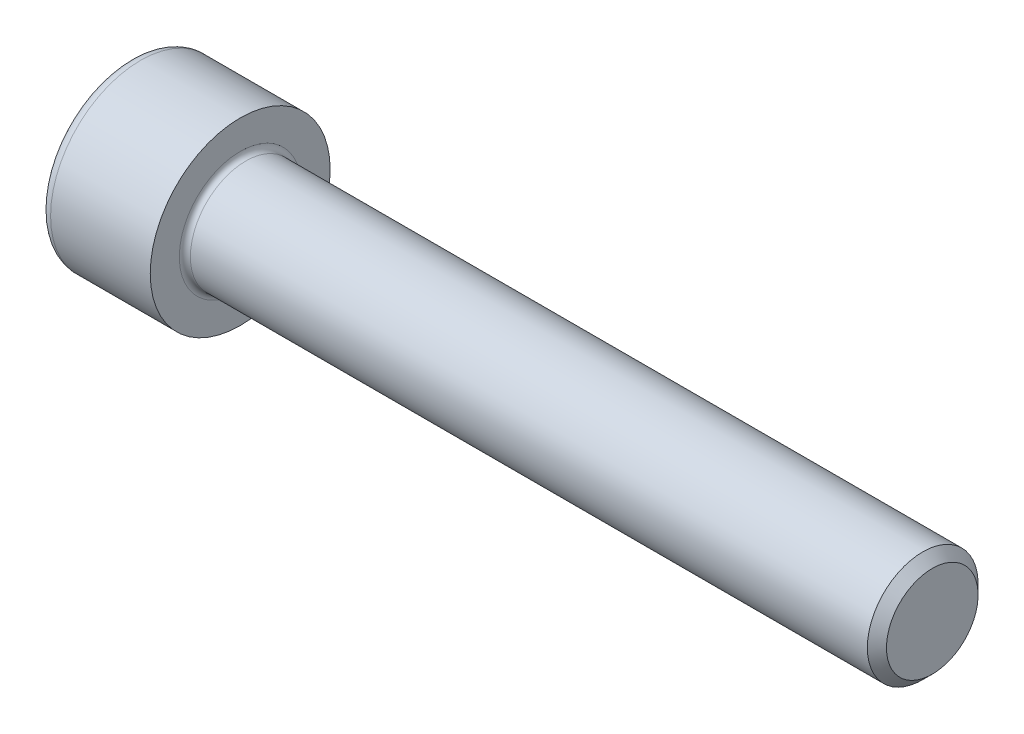
ISO-10303-21;
HEADER;
FILE_DESCRIPTION(('STEP AP214'),'2;1');
FILE_NAME('part.step','',(''),(''),'','','');
FILE_SCHEMA(('AUTOMOTIVE_DESIGN { 1 0 10303 214 1 1 1 1 }'));
ENDSEC;
DATA;
#1=APPLICATION_CONTEXT('core data for automotive mechanical design processes');
#2=APPLICATION_PROTOCOL_DEFINITION('international standard','automotive_design',2000,#1);
#3=PRODUCT_CONTEXT('',#1,'mechanical');
#4=PRODUCT('Part','Part','',(#3));
#5=PRODUCT_RELATED_PRODUCT_CATEGORY('part','',(#4));
#6=PRODUCT_DEFINITION_FORMATION('','',#4);
#7=PRODUCT_DEFINITION_CONTEXT('part definition',#1,'design');
#8=PRODUCT_DEFINITION('design','',#6,#7);
#9=PRODUCT_DEFINITION_SHAPE('','',#8);
#10=(LENGTH_UNIT() NAMED_UNIT(*) SI_UNIT(.MILLI.,.METRE.));
#11=(NAMED_UNIT(*) PLANE_ANGLE_UNIT() SI_UNIT($,.RADIAN.));
#12=(NAMED_UNIT(*) SI_UNIT($,.STERADIAN.) SOLID_ANGLE_UNIT());
#13=UNCERTAINTY_MEASURE_WITH_UNIT(LENGTH_MEASURE(1.E-05),#10,'distance_accuracy_value','');
#14=(GEOMETRIC_REPRESENTATION_CONTEXT(3) GLOBAL_UNCERTAINTY_ASSIGNED_CONTEXT((#13)) GLOBAL_UNIT_ASSIGNED_CONTEXT((#10,
#11,#12)) REPRESENTATION_CONTEXT('',''));
#15=CARTESIAN_POINT('',(0.,0.,0.));
#16=DIRECTION('',(0.,0.,1.));
#17=DIRECTION('',(1.,0.,0.));
#18=AXIS2_PLACEMENT_3D('',#15,#16,#17);
#19=CARTESIAN_POINT('',(0.,0.,0.));
#20=DIRECTION('',(-1.,0.,0.));
#21=DIRECTION('',(0.,0.,1.));
#22=AXIS2_PLACEMENT_3D('',#19,#20,#21);
#23=PLANE('',#22);
#24=DIRECTION('',(0.,-0.499999999999999,0.866025403784439));
#25=VECTOR('',#24,1.);
#26=CARTESIAN_POINT('',(0.,3.47564862052154,0.));
#27=LINE('',#26,#25);
#28=CARTESIAN_POINT('',(0.,3.47564862052154,0.));
#29=VERTEX_POINT('',#28);
#30=CARTESIAN_POINT('',(0.,1.73782431026077,3.00999999999999));
#31=VERTEX_POINT('',#30);
#32=EDGE_CURVE('E260',#29,#31,#27,.T.);
#33=ORIENTED_EDGE('',*,*,#32,.T.);
#34=DIRECTION('',(0.,1.,0.));
#35=VECTOR('',#34,1.);
#36=CARTESIAN_POINT('',(0.,-1.73782431026077,3.01));
#37=LINE('',#36,#35);
#38=CARTESIAN_POINT('',(0.,-1.73782431026077,3.01));
#39=VERTEX_POINT('',#38);
#40=EDGE_CURVE('E132',#39,#31,#37,.T.);
#41=ORIENTED_EDGE('',*,*,#40,.F.);
#42=DIRECTION('',(0.,-0.500000000000001,-0.866025403784438));
#43=VECTOR('',#42,1.);
#44=CARTESIAN_POINT('',(0.,-1.73782431026077,3.01));
#45=LINE('',#44,#43);
#46=CARTESIAN_POINT('',(0.,-3.47564862052155,0.));
#47=VERTEX_POINT('',#46);
#48=EDGE_CURVE('E263',#39,#47,#45,.T.);
#49=ORIENTED_EDGE('',*,*,#48,.T.);
#50=DIRECTION('',(0.,0.499999999999999,-0.866025403784439));
#51=VECTOR('',#50,1.);
#52=CARTESIAN_POINT('',(0.,-3.47564862052155,0.));
#53=LINE('',#52,#51);
#54=CARTESIAN_POINT('',(0.,-1.73782431026078,-3.01));
#55=VERTEX_POINT('',#54);
#56=EDGE_CURVE('E266',#47,#55,#53,.T.);
#57=ORIENTED_EDGE('',*,*,#56,.T.);
#58=DIRECTION('',(0.,-1.,0.));
#59=VECTOR('',#58,1.);
#60=CARTESIAN_POINT('',(0.,1.73782431026076,-3.01));
#61=LINE('',#60,#59);
#62=CARTESIAN_POINT('',(0.,1.73782431026076,-3.01));
#63=VERTEX_POINT('',#62);
#64=EDGE_CURVE('E269',#63,#55,#61,.T.);
#65=ORIENTED_EDGE('',*,*,#64,.F.);
#66=DIRECTION('',(0.,-0.500000000000001,-0.866025403784438));
#67=VECTOR('',#66,1.);
#68=CARTESIAN_POINT('',(0.,3.47564862052154,0.));
#69=LINE('',#68,#67);
#70=EDGE_CURVE('E127',#29,#63,#69,.T.);
#71=ORIENTED_EDGE('',*,*,#70,.F.);
#72=EDGE_LOOP('',(#33,#41,#49,#57,#65,#71));
#73=FACE_BOUND('',#72,.T.);
#74=CARTESIAN_POINT('',(0.,0.,0.));
#75=DIRECTION('',(-1.,0.,0.));
#76=DIRECTION('',(0.,0.,1.));
#77=AXIS2_PLACEMENT_3D('',#74,#75,#76);
#78=CIRCLE('',#77,5.7);
#79=CARTESIAN_POINT('',(0.,0.,5.7));
#80=VERTEX_POINT('',#79);
#81=EDGE_CURVE('E44',#80,#80,#78,.T.);
#82=ORIENTED_EDGE('',*,*,#81,.T.);
#83=EDGE_LOOP('',(#82));
#84=FACE_BOUND('',#83,.T.);
#85=ADVANCED_FACE('F36',(#73,#84),#23,.T.);
#86=CARTESIAN_POINT('',(-31.75,0.,0.));
#87=DIRECTION('',(-1.,0.,0.));
#88=DIRECTION('',(0.,0.,1.));
#89=AXIS2_PLACEMENT_3D('',#86,#87,#88);
#90=CYLINDRICAL_SURFACE('',#89,6.5);
#91=CARTESIAN_POINT('',(0.800000000000002,0.,0.));
#92=DIRECTION('',(-1.,0.,0.));
#93=DIRECTION('',(0.,0.,1.));
#94=AXIS2_PLACEMENT_3D('',#91,#92,#93);
#95=CIRCLE('',#94,6.5);
#96=CARTESIAN_POINT('',(0.800000000000002,0.,6.5));
#97=VERTEX_POINT('',#96);
#98=EDGE_CURVE('E11',#97,#97,#95,.F.);
#99=ORIENTED_EDGE('',*,*,#98,.T.);
#100=EDGE_LOOP('',(#99));
#101=FACE_BOUND('',#100,.T.);
#102=CARTESIAN_POINT('',(8.,0.,0.));
#103=DIRECTION('',(-1.,0.,0.));
#104=DIRECTION('',(0.,0.,1.));
#105=AXIS2_PLACEMENT_3D('',#102,#103,#104);
#106=CIRCLE('',#105,6.5);
#107=CARTESIAN_POINT('',(8.,0.,6.5));
#108=VERTEX_POINT('',#107);
#109=EDGE_CURVE('E150',#108,#108,#106,.T.);
#110=ORIENTED_EDGE('',*,*,#109,.T.);
#111=EDGE_LOOP('',(#110));
#112=FACE_BOUND('',#111,.T.);
#113=ADVANCED_FACE('F174',(#101,#112),#90,.T.);
#114=CARTESIAN_POINT('',(8.,6.5,0.));
#115=DIRECTION('',(1.,0.,0.));
#116=DIRECTION('',(0.,0.,-1.));
#117=AXIS2_PLACEMENT_3D('',#114,#115,#116);
#118=PLANE('',#117);
#119=CARTESIAN_POINT('',(8.,0.,0.));
#120=DIRECTION('',(1.,0.,0.));
#121=DIRECTION('',(0.,0.,-1.));
#122=AXIS2_PLACEMENT_3D('',#119,#120,#121);
#123=CIRCLE('',#122,4.39999999999985);
#124=CARTESIAN_POINT('',(8.,0.,-4.39999999999985));
#125=VERTEX_POINT('',#124);
#126=EDGE_CURVE('E153',#125,#125,#123,.F.);
#127=ORIENTED_EDGE('',*,*,#126,.T.);
#128=EDGE_LOOP('',(#127));
#129=FACE_BOUND('',#128,.T.);
#130=ORIENTED_EDGE('',*,*,#109,.F.);
#131=EDGE_LOOP('',(#130));
#132=FACE_BOUND('',#131,.T.);
#133=ADVANCED_FACE('F180',(#129,#132),#118,.T.);
#134=CARTESIAN_POINT('',(-31.75,0.,0.));
#135=DIRECTION('',(-1.,0.,0.));
#136=DIRECTION('',(0.,0.,1.));
#137=AXIS2_PLACEMENT_3D('',#134,#135,#136);
#138=CYLINDRICAL_SURFACE('',#137,3.99999999999985);
#139=CARTESIAN_POINT('',(8.4,0.,0.));
#140=DIRECTION('',(1.,0.,0.));
#141=DIRECTION('',(0.,0.,-1.));
#142=AXIS2_PLACEMENT_3D('',#139,#140,#141);
#143=CIRCLE('',#142,3.99999999999985);
#144=CARTESIAN_POINT('',(8.4,0.,-3.99999999999985));
#145=VERTEX_POINT('',#144);
#146=EDGE_CURVE('E156',#145,#145,#143,.T.);
#147=ORIENTED_EDGE('',*,*,#146,.T.);
#148=EDGE_LOOP('',(#147));
#149=FACE_BOUND('',#148,.T.);
#150=CARTESIAN_POINT('',(57.3094999999997,0.,0.));
#151=DIRECTION('',(-1.,0.,0.));
#152=DIRECTION('',(0.,0.,1.));
#153=AXIS2_PLACEMENT_3D('',#150,#151,#152);
#154=CIRCLE('',#153,3.99999999999971);
#155=CARTESIAN_POINT('',(57.3094999999997,0.,3.99999999999971));
#156=VERTEX_POINT('',#155);
#157=EDGE_CURVE('E147',#156,#156,#154,.T.);
#158=ORIENTED_EDGE('',*,*,#157,.T.);
#159=EDGE_LOOP('',(#158));
#160=FACE_BOUND('',#159,.T.);
#161=ADVANCED_FACE('F186',(#149,#160),#138,.T.);
#162=CARTESIAN_POINT('',(58.,0.,0.));
#163=DIRECTION('',(-1.,0.,0.));
#164=DIRECTION('',(0.,0.,1.));
#165=AXIS2_PLACEMENT_3D('',#162,#163,#164);
#166=CONICAL_SURFACE('',#165,3.3095,0.78539816339702);
#167=ORIENTED_EDGE('',*,*,#157,.F.);
#168=EDGE_LOOP('',(#167));
#169=FACE_BOUND('',#168,.T.);
#170=CARTESIAN_POINT('',(58.,0.,0.));
#171=DIRECTION('',(-1.,0.,0.));
#172=DIRECTION('',(0.,0.,1.));
#173=AXIS2_PLACEMENT_3D('',#170,#171,#172);
#174=CIRCLE('',#173,3.3095);
#175=CARTESIAN_POINT('',(58.,0.,3.3095));
#176=VERTEX_POINT('',#175);
#177=EDGE_CURVE('E143',#176,#176,#174,.T.);
#178=ORIENTED_EDGE('',*,*,#177,.T.);
#179=EDGE_LOOP('',(#178));
#180=FACE_BOUND('',#179,.T.);
#181=ADVANCED_FACE('F190',(#169,#180),#166,.T.);
#182=CARTESIAN_POINT('',(58.,3.3095,0.));
#183=DIRECTION('',(1.,0.,0.));
#184=DIRECTION('',(0.,0.,-1.));
#185=AXIS2_PLACEMENT_3D('',#182,#183,#184);
#186=PLANE('',#185);
#187=ORIENTED_EDGE('',*,*,#177,.F.);
#188=EDGE_LOOP('',(#187));
#189=FACE_BOUND('',#188,.T.);
#190=ADVANCED_FACE('F170',(#189),#186,.T.);
#191=CARTESIAN_POINT('',(8.4,0.,0.));
#192=DIRECTION('',(1.,0.,0.));
#193=DIRECTION('',(0.,0.,-1.));
#194=AXIS2_PLACEMENT_3D('',#191,#192,#193);
#195=TOROIDAL_SURFACE('',#194,4.39999999999985,0.4);
#196=ORIENTED_EDGE('',*,*,#146,.F.);
#197=EDGE_LOOP('',(#196));
#198=FACE_BOUND('',#197,.T.);
#199=ORIENTED_EDGE('',*,*,#126,.F.);
#200=EDGE_LOOP('',(#199));
#201=FACE_BOUND('',#200,.T.);
#202=ADVANCED_FACE('F163',(#198,#201),#195,.F.);
#203=CARTESIAN_POINT('',(0.800000000000002,0.,0.));
#204=DIRECTION('',(-1.,0.,0.));
#205=DIRECTION('',(0.,0.,1.));
#206=AXIS2_PLACEMENT_3D('',#203,#204,#205);
#207=TOROIDAL_SURFACE('',#206,5.7,0.8);
#208=ORIENTED_EDGE('',*,*,#98,.F.);
#209=EDGE_LOOP('',(#208));
#210=FACE_BOUND('',#209,.T.);
#211=ORIENTED_EDGE('',*,*,#81,.F.);
#212=EDGE_LOOP('',(#211));
#213=FACE_BOUND('',#212,.T.);
#214=ADVANCED_FACE('F38',(#210,#213),#207,.T.);
#215=CARTESIAN_POINT('',(4.,3.47564862052154,0.));
#216=DIRECTION('',(0.,-0.866025403784439,-0.499999999999999));
#217=DIRECTION('',(0.,0.499999999999999,-0.866025403784439));
#218=AXIS2_PLACEMENT_3D('',#215,#216,#217);
#219=PLANE('',#218);
#220=ORIENTED_EDGE('',*,*,#32,.F.);
#221=DIRECTION('',(-1.,0.,0.));
#222=VECTOR('',#221,1.);
#223=CARTESIAN_POINT('',(4.,3.47564862052154,0.));
#224=LINE('',#223,#222);
#225=CARTESIAN_POINT('',(4.,3.47564862052154,0.));
#226=VERTEX_POINT('',#225);
#227=EDGE_CURVE('E250',#226,#29,#224,.T.);
#228=ORIENTED_EDGE('',*,*,#227,.F.);
#229=DIRECTION('',(0.,-0.499999999999999,0.866025403784439));
#230=VECTOR('',#229,1.);
#231=CARTESIAN_POINT('',(4.,3.47564862052154,0.));
#232=LINE('',#231,#230);
#233=CARTESIAN_POINT('',(4.,2.60673646539116,1.50499999999999));
#234=VERTEX_POINT('',#233);
#235=EDGE_CURVE('E119',#226,#234,#232,.T.);
#236=ORIENTED_EDGE('',*,*,#235,.T.);
#237=CARTESIAN_POINT('',(4.,1.73782431026077,3.00999999999999));
#238=VERTEX_POINT('',#237);
#239=EDGE_CURVE('E110',#234,#238,#232,.T.);
#240=ORIENTED_EDGE('',*,*,#239,.T.);
#241=DIRECTION('',(-1.,0.,0.));
#242=VECTOR('',#241,1.);
#243=CARTESIAN_POINT('',(4.,1.73782431026077,3.00999999999999));
#244=LINE('',#243,#242);
#245=EDGE_CURVE('E124',#238,#31,#244,.T.);
#246=ORIENTED_EDGE('',*,*,#245,.T.);
#247=EDGE_LOOP('',(#220,#228,#236,#240,#246));
#248=FACE_BOUND('',#247,.T.);
#249=ADVANCED_FACE('F123',(#248),#219,.T.);
#250=CARTESIAN_POINT('',(4.,-1.73782431026077,3.01));
#251=DIRECTION('',(0.,0.,1.));
#252=DIRECTION('',(0.,-1.,0.));
#253=AXIS2_PLACEMENT_3D('',#250,#251,#252);
#254=PLANE('',#253);
#255=ORIENTED_EDGE('',*,*,#40,.T.);
#256=ORIENTED_EDGE('',*,*,#245,.F.);
#257=DIRECTION('',(0.,1.,0.));
#258=VECTOR('',#257,1.);
#259=CARTESIAN_POINT('',(4.,-1.73782431026077,3.01));
#260=LINE('',#259,#258);
#261=CARTESIAN_POINT('',(4.,0.,3.00999999999999));
#262=VERTEX_POINT('',#261);
#263=EDGE_CURVE('E107',#262,#238,#260,.T.);
#264=ORIENTED_EDGE('',*,*,#263,.F.);
#265=CARTESIAN_POINT('',(4.,-1.73782431026077,3.01));
#266=VERTEX_POINT('',#265);
#267=EDGE_CURVE('E118',#266,#262,#260,.T.);
#268=ORIENTED_EDGE('',*,*,#267,.F.);
#269=DIRECTION('',(-1.,0.,0.));
#270=VECTOR('',#269,1.);
#271=CARTESIAN_POINT('',(4.,-1.73782431026077,3.01));
#272=LINE('',#271,#270);
#273=EDGE_CURVE('E134',#266,#39,#272,.T.);
#274=ORIENTED_EDGE('',*,*,#273,.T.);
#275=EDGE_LOOP('',(#255,#256,#264,#268,#274));
#276=FACE_BOUND('',#275,.T.);
#277=ADVANCED_FACE('F129',(#276),#254,.F.);
#278=CARTESIAN_POINT('',(4.,-1.73782431026077,3.01));
#279=DIRECTION('',(0.,0.866025403784438,-0.500000000000001));
#280=DIRECTION('',(0.,0.500000000000001,0.866025403784438));
#281=AXIS2_PLACEMENT_3D('',#278,#279,#280);
#282=PLANE('',#281);
#283=ORIENTED_EDGE('',*,*,#48,.F.);
#284=ORIENTED_EDGE('',*,*,#273,.F.);
#285=DIRECTION('',(0.,-0.500000000000001,-0.866025403784438));
#286=VECTOR('',#285,1.);
#287=CARTESIAN_POINT('',(4.,-1.73782431026077,3.01));
#288=LINE('',#287,#286);
#289=CARTESIAN_POINT('',(4.,-2.60673646539116,1.505));
#290=VERTEX_POINT('',#289);
#291=EDGE_CURVE('E289',#266,#290,#288,.T.);
#292=ORIENTED_EDGE('',*,*,#291,.T.);
#293=CARTESIAN_POINT('',(4.,-3.47564862052155,0.));
#294=VERTEX_POINT('',#293);
#295=EDGE_CURVE('E278',#290,#294,#288,.T.);
#296=ORIENTED_EDGE('',*,*,#295,.T.);
#297=DIRECTION('',(-1.,0.,0.));
#298=VECTOR('',#297,1.);
#299=CARTESIAN_POINT('',(4.,-3.47564862052155,0.));
#300=LINE('',#299,#298);
#301=EDGE_CURVE('E139',#294,#47,#300,.T.);
#302=ORIENTED_EDGE('',*,*,#301,.T.);
#303=EDGE_LOOP('',(#283,#284,#292,#296,#302));
#304=FACE_BOUND('',#303,.T.);
#305=ADVANCED_FACE('F204',(#304),#282,.T.);
#306=CARTESIAN_POINT('',(4.,-3.47564862052155,0.));
#307=DIRECTION('',(0.,0.866025403784439,0.499999999999999));
#308=DIRECTION('',(0.,-0.499999999999999,0.866025403784439));
#309=AXIS2_PLACEMENT_3D('',#306,#307,#308);
#310=PLANE('',#309);
#311=ORIENTED_EDGE('',*,*,#56,.F.);
#312=ORIENTED_EDGE('',*,*,#301,.F.);
#313=DIRECTION('',(0.,0.499999999999999,-0.866025403784439));
#314=VECTOR('',#313,1.);
#315=CARTESIAN_POINT('',(4.,-3.47564862052155,0.));
#316=LINE('',#315,#314);
#317=CARTESIAN_POINT('',(4.,-2.60673646539117,-1.505));
#318=VERTEX_POINT('',#317);
#319=EDGE_CURVE('E256',#294,#318,#316,.T.);
#320=ORIENTED_EDGE('',*,*,#319,.T.);
#321=CARTESIAN_POINT('',(4.,-1.73782431026078,-3.01));
#322=VERTEX_POINT('',#321);
#323=EDGE_CURVE('E288',#318,#322,#316,.T.);
#324=ORIENTED_EDGE('',*,*,#323,.T.);
#325=DIRECTION('',(-1.,0.,0.));
#326=VECTOR('',#325,1.);
#327=CARTESIAN_POINT('',(4.,-1.73782431026078,-3.01));
#328=LINE('',#327,#326);
#329=EDGE_CURVE('E249',#322,#55,#328,.T.);
#330=ORIENTED_EDGE('',*,*,#329,.T.);
#331=EDGE_LOOP('',(#311,#312,#320,#324,#330));
#332=FACE_BOUND('',#331,.T.);
#333=ADVANCED_FACE('F207',(#332),#310,.T.);
#334=CARTESIAN_POINT('',(4.,1.73782431026076,-3.01));
#335=DIRECTION('',(0.,0.,-1.));
#336=DIRECTION('',(0.,1.,0.));
#337=AXIS2_PLACEMENT_3D('',#334,#335,#336);
#338=PLANE('',#337);
#339=ORIENTED_EDGE('',*,*,#64,.T.);
#340=ORIENTED_EDGE('',*,*,#329,.F.);
#341=DIRECTION('',(0.,-1.,0.));
#342=VECTOR('',#341,1.);
#343=CARTESIAN_POINT('',(4.,1.73782431026076,-3.01));
#344=LINE('',#343,#342);
#345=CARTESIAN_POINT('',(4.,0.,-3.01));
#346=VERTEX_POINT('',#345);
#347=EDGE_CURVE('E253',#346,#322,#344,.T.);
#348=ORIENTED_EDGE('',*,*,#347,.F.);
#349=CARTESIAN_POINT('',(4.,1.73782431026076,-3.01));
#350=VERTEX_POINT('',#349);
#351=EDGE_CURVE('E51',#350,#346,#344,.T.);
#352=ORIENTED_EDGE('',*,*,#351,.F.);
#353=DIRECTION('',(-1.,0.,0.));
#354=VECTOR('',#353,1.);
#355=CARTESIAN_POINT('',(4.,1.73782431026076,-3.01));
#356=LINE('',#355,#354);
#357=EDGE_CURVE('E246',#350,#63,#356,.T.);
#358=ORIENTED_EDGE('',*,*,#357,.T.);
#359=EDGE_LOOP('',(#339,#340,#348,#352,#358));
#360=FACE_BOUND('',#359,.T.);
#361=ADVANCED_FACE('F211',(#360),#338,.F.);
#362=CARTESIAN_POINT('',(4.,3.47564862052154,0.));
#363=DIRECTION('',(0.,0.866025403784438,-0.500000000000001));
#364=DIRECTION('',(0.,0.500000000000001,0.866025403784438));
#365=AXIS2_PLACEMENT_3D('',#362,#363,#364);
#366=PLANE('',#365);
#367=ORIENTED_EDGE('',*,*,#70,.T.);
#368=ORIENTED_EDGE('',*,*,#357,.F.);
#369=DIRECTION('',(0.,-0.500000000000001,-0.866025403784438));
#370=VECTOR('',#369,1.);
#371=CARTESIAN_POINT('',(4.,3.47564862052154,0.));
#372=LINE('',#371,#370);
#373=CARTESIAN_POINT('',(4.,2.60673646539116,-1.505));
#374=VERTEX_POINT('',#373);
#375=EDGE_CURVE('E236',#374,#350,#372,.T.);
#376=ORIENTED_EDGE('',*,*,#375,.F.);
#377=EDGE_CURVE('E242',#226,#374,#372,.T.);
#378=ORIENTED_EDGE('',*,*,#377,.F.);
#379=ORIENTED_EDGE('',*,*,#227,.T.);
#380=EDGE_LOOP('',(#367,#368,#376,#378,#379));
#381=FACE_BOUND('',#380,.T.);
#382=ADVANCED_FACE('F215',(#381),#366,.F.);
#383=CARTESIAN_POINT('',(4.,5.21347293078231,-3.01000000000001));
#384=DIRECTION('',(1.,0.,0.));
#385=DIRECTION('',(0.,0.,-1.));
#386=AXIS2_PLACEMENT_3D('',#383,#384,#385);
#387=PLANE('',#386);
#388=ORIENTED_EDGE('',*,*,#347,.T.);
#389=ORIENTED_EDGE('',*,*,#323,.F.);
#390=CARTESIAN_POINT('',(4.,0.,0.));
#391=DIRECTION('',(-1.,0.,0.));
#392=DIRECTION('',(0.,0.,1.));
#393=AXIS2_PLACEMENT_3D('',#390,#391,#392);
#394=CIRCLE('',#393,3.01);
#395=EDGE_CURVE('E284',#346,#318,#394,.T.);
#396=ORIENTED_EDGE('',*,*,#395,.F.);
#397=EDGE_LOOP('',(#388,#389,#396));
#398=FACE_BOUND('',#397,.T.);
#399=ADVANCED_FACE('F219',(#398),#387,.F.);
#400=ORIENTED_EDGE('',*,*,#319,.F.);
#401=ORIENTED_EDGE('',*,*,#295,.F.);
#402=EDGE_CURVE('E137',#318,#290,#394,.T.);
#403=ORIENTED_EDGE('',*,*,#402,.F.);
#404=EDGE_LOOP('',(#400,#401,#403));
#405=FACE_BOUND('',#404,.T.);
#406=ADVANCED_FACE('F222',(#405),#387,.F.);
#407=ORIENTED_EDGE('',*,*,#291,.F.);
#408=ORIENTED_EDGE('',*,*,#267,.T.);
#409=EDGE_CURVE('E133',#290,#262,#394,.T.);
#410=ORIENTED_EDGE('',*,*,#409,.F.);
#411=EDGE_LOOP('',(#407,#408,#410));
#412=FACE_BOUND('',#411,.T.);
#413=ADVANCED_FACE('F227',(#412),#387,.F.);
#414=ORIENTED_EDGE('',*,*,#263,.T.);
#415=ORIENTED_EDGE('',*,*,#239,.F.);
#416=EDGE_CURVE('E113',#262,#234,#394,.T.);
#417=ORIENTED_EDGE('',*,*,#416,.F.);
#418=EDGE_LOOP('',(#414,#415,#417));
#419=FACE_BOUND('',#418,.T.);
#420=ADVANCED_FACE('F109',(#419),#387,.F.);
#421=ORIENTED_EDGE('',*,*,#235,.F.);
#422=ORIENTED_EDGE('',*,*,#377,.T.);
#423=EDGE_CURVE('E144',#234,#374,#394,.T.);
#424=ORIENTED_EDGE('',*,*,#423,.F.);
#425=EDGE_LOOP('',(#421,#422,#424));
#426=FACE_BOUND('',#425,.T.);
#427=ADVANCED_FACE('F230',(#426),#387,.F.);
#428=ORIENTED_EDGE('',*,*,#375,.T.);
#429=ORIENTED_EDGE('',*,*,#351,.T.);
#430=EDGE_CURVE('E239',#374,#346,#394,.T.);
#431=ORIENTED_EDGE('',*,*,#430,.F.);
#432=EDGE_LOOP('',(#428,#429,#431));
#433=FACE_BOUND('',#432,.T.);
#434=ADVANCED_FACE('F200',(#433),#387,.F.);
#435=CARTESIAN_POINT('',(4.,0.,0.));
#436=DIRECTION('',(-1.,0.,0.));
#437=DIRECTION('',(0.,0.,1.));
#438=AXIS2_PLACEMENT_3D('',#435,#436,#437);
#439=CONICAL_SURFACE('',#438,3.01,1.04719755119659);
#440=CARTESIAN_POINT('',(5.73782431026079,0.,0.));
#441=VERTEX_POINT('',#440);
#442=VERTEX_LOOP('',#441);
#443=FACE_BOUND('',#442,.T.);
#444=ORIENTED_EDGE('',*,*,#416,.T.);
#445=ORIENTED_EDGE('',*,*,#423,.T.);
#446=ORIENTED_EDGE('',*,*,#430,.T.);
#447=ORIENTED_EDGE('',*,*,#395,.T.);
#448=ORIENTED_EDGE('',*,*,#402,.T.);
#449=ORIENTED_EDGE('',*,*,#409,.T.);
#450=EDGE_LOOP('',(#444,#445,#446,#447,#448,#449));
#451=FACE_BOUND('',#450,.T.);
#452=ADVANCED_FACE('F198',(#443,#451),#439,.F.);
#453=CLOSED_SHELL('',(#85,#113,#133,#161,#181,#190,#202,#214,#249,#277,#305,#333,#361,#382,#399,
#406,#413,#420,#427,#434,#452));
#454=MANIFOLD_SOLID_BREP('B2',#453);
#455=ADVANCED_BREP_SHAPE_REPRESENTATION('',(#18,#454),#14);
#456=SHAPE_DEFINITION_REPRESENTATION(#9,#455);
ENDSEC;
END-ISO-10303-21;
